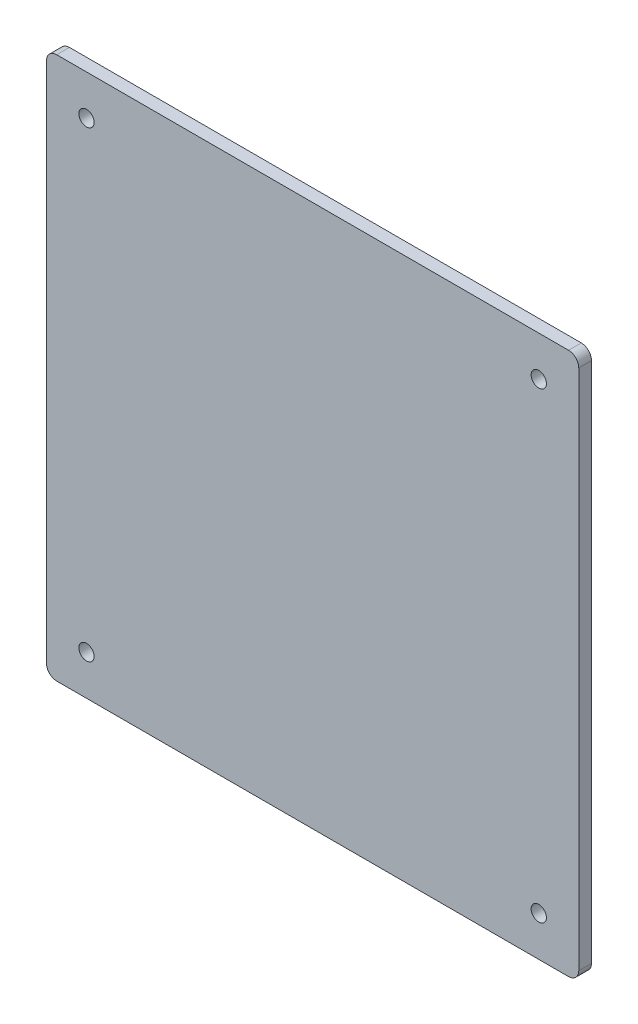
ISO-10303-21;
HEADER;
FILE_DESCRIPTION(('STEP AP214'),'2;1');
FILE_NAME('part.step','',(''),(''),'','','');
FILE_SCHEMA(('AUTOMOTIVE_DESIGN { 1 0 10303 214 1 1 1 1 }'));
ENDSEC;
DATA;
#1=APPLICATION_CONTEXT('core data for automotive mechanical design processes');
#2=APPLICATION_PROTOCOL_DEFINITION('international standard','automotive_design',2000,#1);
#3=PRODUCT_CONTEXT('',#1,'mechanical');
#4=PRODUCT('Part','Part','',(#3));
#5=PRODUCT_RELATED_PRODUCT_CATEGORY('part','',(#4));
#6=PRODUCT_DEFINITION_FORMATION('','',#4);
#7=PRODUCT_DEFINITION_CONTEXT('part definition',#1,'design');
#8=PRODUCT_DEFINITION('design','',#6,#7);
#9=PRODUCT_DEFINITION_SHAPE('','',#8);
#10=(LENGTH_UNIT() NAMED_UNIT(*) SI_UNIT(.MILLI.,.METRE.));
#11=(NAMED_UNIT(*) PLANE_ANGLE_UNIT() SI_UNIT($,.RADIAN.));
#12=(NAMED_UNIT(*) SI_UNIT($,.STERADIAN.) SOLID_ANGLE_UNIT());
#13=UNCERTAINTY_MEASURE_WITH_UNIT(LENGTH_MEASURE(1.E-05),#10,'distance_accuracy_value','');
#14=(GEOMETRIC_REPRESENTATION_CONTEXT(3) GLOBAL_UNCERTAINTY_ASSIGNED_CONTEXT((#13)) GLOBAL_UNIT_ASSIGNED_CONTEXT((#10,
#11,#12)) REPRESENTATION_CONTEXT('',''));
#15=CARTESIAN_POINT('',(0.,0.,0.));
#16=DIRECTION('',(0.,0.,1.));
#17=DIRECTION('',(1.,0.,0.));
#18=AXIS2_PLACEMENT_3D('',#15,#16,#17);
#19=CARTESIAN_POINT('',(0.,0.,3.175));
#20=DIRECTION('',(1.,0.,0.));
#21=DIRECTION('',(0.,0.,-1.));
#22=AXIS2_PLACEMENT_3D('',#19,#20,#21);
#23=PLANE('',#22);
#24=DIRECTION('',(0.,-1.,0.));
#25=VECTOR('',#24,1.);
#26=CARTESIAN_POINT('',(0.,0.,3.175));
#27=LINE('',#26,#25);
#28=CARTESIAN_POINT('',(0.,132.715,3.175));
#29=VERTEX_POINT('',#28);
#30=CARTESIAN_POINT('',(0.,2.54,3.175));
#31=VERTEX_POINT('',#30);
#32=EDGE_CURVE('E122',#29,#31,#27,.T.);
#33=ORIENTED_EDGE('',*,*,#32,.F.);
#34=DIRECTION('',(0.,0.,-1.));
#35=VECTOR('',#34,1.);
#36=CARTESIAN_POINT('',(0.,132.715,3.175));
#37=LINE('',#36,#35);
#38=CARTESIAN_POINT('',(0.,132.715,0.));
#39=VERTEX_POINT('',#38);
#40=EDGE_CURVE('E107',#29,#39,#37,.T.);
#41=ORIENTED_EDGE('',*,*,#40,.T.);
#42=DIRECTION('',(0.,-1.,0.));
#43=VECTOR('',#42,1.);
#44=CARTESIAN_POINT('',(0.,0.,0.));
#45=LINE('',#44,#43);
#46=CARTESIAN_POINT('',(0.,2.54,0.));
#47=VERTEX_POINT('',#46);
#48=EDGE_CURVE('E119',#39,#47,#45,.T.);
#49=ORIENTED_EDGE('',*,*,#48,.T.);
#50=DIRECTION('',(0.,0.,-1.));
#51=VECTOR('',#50,1.);
#52=CARTESIAN_POINT('',(0.,2.54,3.175));
#53=LINE('',#52,#51);
#54=EDGE_CURVE('E124',#47,#31,#53,.F.);
#55=ORIENTED_EDGE('',*,*,#54,.T.);
#56=EDGE_LOOP('',(#33,#41,#49,#55));
#57=FACE_BOUND('',#56,.T.);
#58=ADVANCED_FACE('F37',(#57),#23,.F.);
#59=CARTESIAN_POINT('',(0.,0.,3.175));
#60=DIRECTION('',(0.,1.,0.));
#61=DIRECTION('',(0.,0.,1.));
#62=AXIS2_PLACEMENT_3D('',#59,#60,#61);
#63=PLANE('',#62);
#64=DIRECTION('',(1.,0.,0.));
#65=VECTOR('',#64,1.);
#66=CARTESIAN_POINT('',(0.,0.,3.175));
#67=LINE('',#66,#65);
#68=CARTESIAN_POINT('',(2.54,0.,3.175));
#69=VERTEX_POINT('',#68);
#70=CARTESIAN_POINT('',(130.175,0.,3.175));
#71=VERTEX_POINT('',#70);
#72=EDGE_CURVE('E168',#69,#71,#67,.T.);
#73=ORIENTED_EDGE('',*,*,#72,.F.);
#74=DIRECTION('',(0.,0.,-1.));
#75=VECTOR('',#74,1.);
#76=CARTESIAN_POINT('',(2.54,0.,3.175));
#77=LINE('',#76,#75);
#78=CARTESIAN_POINT('',(2.54,0.,0.));
#79=VERTEX_POINT('',#78);
#80=EDGE_CURVE('E161',#69,#79,#77,.T.);
#81=ORIENTED_EDGE('',*,*,#80,.T.);
#82=DIRECTION('',(1.,0.,0.));
#83=VECTOR('',#82,1.);
#84=CARTESIAN_POINT('',(0.,0.,0.));
#85=LINE('',#84,#83);
#86=CARTESIAN_POINT('',(130.175,0.,0.));
#87=VERTEX_POINT('',#86);
#88=EDGE_CURVE('E128',#79,#87,#85,.T.);
#89=ORIENTED_EDGE('',*,*,#88,.T.);
#90=DIRECTION('',(0.,0.,-1.));
#91=VECTOR('',#90,1.);
#92=CARTESIAN_POINT('',(130.175,0.,3.175));
#93=LINE('',#92,#91);
#94=EDGE_CURVE('E159',#87,#71,#93,.F.);
#95=ORIENTED_EDGE('',*,*,#94,.T.);
#96=EDGE_LOOP('',(#73,#81,#89,#95));
#97=FACE_BOUND('',#96,.T.);
#98=ADVANCED_FACE('F166',(#97),#63,.F.);
#99=CARTESIAN_POINT('',(132.715,0.,3.175));
#100=DIRECTION('',(-1.,0.,0.));
#101=DIRECTION('',(0.,0.,1.));
#102=AXIS2_PLACEMENT_3D('',#99,#100,#101);
#103=PLANE('',#102);
#104=DIRECTION('',(0.,1.,0.));
#105=VECTOR('',#104,1.);
#106=CARTESIAN_POINT('',(132.715,0.,3.175));
#107=LINE('',#106,#105);
#108=CARTESIAN_POINT('',(132.715,2.54,3.175));
#109=VERTEX_POINT('',#108);
#110=CARTESIAN_POINT('',(132.715,132.715,3.175));
#111=VERTEX_POINT('',#110);
#112=EDGE_CURVE('E176',#109,#111,#107,.T.);
#113=ORIENTED_EDGE('',*,*,#112,.F.);
#114=DIRECTION('',(0.,0.,-1.));
#115=VECTOR('',#114,1.);
#116=CARTESIAN_POINT('',(132.715,2.54,3.175));
#117=LINE('',#116,#115);
#118=CARTESIAN_POINT('',(132.715,2.54,0.));
#119=VERTEX_POINT('',#118);
#120=EDGE_CURVE('E11',#109,#119,#117,.T.);
#121=ORIENTED_EDGE('',*,*,#120,.T.);
#122=DIRECTION('',(0.,1.,0.));
#123=VECTOR('',#122,1.);
#124=CARTESIAN_POINT('',(132.715,0.,0.));
#125=LINE('',#124,#123);
#126=CARTESIAN_POINT('',(132.715,132.715,0.));
#127=VERTEX_POINT('',#126);
#128=EDGE_CURVE('E132',#119,#127,#125,.T.);
#129=ORIENTED_EDGE('',*,*,#128,.T.);
#130=DIRECTION('',(0.,0.,-1.));
#131=VECTOR('',#130,1.);
#132=CARTESIAN_POINT('',(132.715,132.715,3.175));
#133=LINE('',#132,#131);
#134=EDGE_CURVE('E45',#127,#111,#133,.F.);
#135=ORIENTED_EDGE('',*,*,#134,.T.);
#136=EDGE_LOOP('',(#113,#121,#129,#135));
#137=FACE_BOUND('',#136,.T.);
#138=ADVANCED_FACE('F175',(#137),#103,.F.);
#139=CARTESIAN_POINT('',(0.,135.255,3.175));
#140=DIRECTION('',(0.,-1.,0.));
#141=DIRECTION('',(0.,0.,-1.));
#142=AXIS2_PLACEMENT_3D('',#139,#140,#141);
#143=PLANE('',#142);
#144=DIRECTION('',(-1.,0.,0.));
#145=VECTOR('',#144,1.);
#146=CARTESIAN_POINT('',(0.,135.255,0.));
#147=LINE('',#146,#145);
#148=CARTESIAN_POINT('',(130.175,135.255,0.));
#149=VERTEX_POINT('',#148);
#150=CARTESIAN_POINT('',(2.54,135.255,0.));
#151=VERTEX_POINT('',#150);
#152=EDGE_CURVE('E142',#149,#151,#147,.T.);
#153=ORIENTED_EDGE('',*,*,#152,.T.);
#154=DIRECTION('',(0.,0.,-1.));
#155=VECTOR('',#154,1.);
#156=CARTESIAN_POINT('',(2.54,135.255,3.175));
#157=LINE('',#156,#155);
#158=CARTESIAN_POINT('',(2.54,135.255,3.175));
#159=VERTEX_POINT('',#158);
#160=EDGE_CURVE('E108',#151,#159,#157,.F.);
#161=ORIENTED_EDGE('',*,*,#160,.T.);
#162=DIRECTION('',(-1.,0.,0.));
#163=VECTOR('',#162,1.);
#164=CARTESIAN_POINT('',(0.,135.255,3.175));
#165=LINE('',#164,#163);
#166=CARTESIAN_POINT('',(130.175,135.255,3.175));
#167=VERTEX_POINT('',#166);
#168=EDGE_CURVE('E138',#167,#159,#165,.T.);
#169=ORIENTED_EDGE('',*,*,#168,.F.);
#170=DIRECTION('',(0.,0.,-1.));
#171=VECTOR('',#170,1.);
#172=CARTESIAN_POINT('',(130.175,135.255,3.175));
#173=LINE('',#172,#171);
#174=EDGE_CURVE('E113',#167,#149,#173,.T.);
#175=ORIENTED_EDGE('',*,*,#174,.T.);
#176=EDGE_LOOP('',(#153,#161,#169,#175));
#177=FACE_BOUND('',#176,.T.);
#178=ADVANCED_FACE('F216',(#177),#143,.F.);
#179=CARTESIAN_POINT('',(0.,0.,3.175));
#180=DIRECTION('',(0.,0.,-1.));
#181=DIRECTION('',(-1.,0.,0.));
#182=AXIS2_PLACEMENT_3D('',#179,#180,#181);
#183=PLANE('',#182);
#184=CARTESIAN_POINT('',(9.96950000000001,9.96950000000001,3.175));
#185=DIRECTION('',(0.,0.,1.));
#186=DIRECTION('',(1.,0.,0.));
#187=AXIS2_PLACEMENT_3D('',#184,#185,#186);
#188=CIRCLE('',#187,1.905);
#189=CARTESIAN_POINT('',(11.8745,9.96950000000001,3.175));
#190=VERTEX_POINT('',#189);
#191=EDGE_CURVE('E185',#190,#190,#188,.T.);
#192=ORIENTED_EDGE('',*,*,#191,.F.);
#193=EDGE_LOOP('',(#192));
#194=FACE_BOUND('',#193,.T.);
#195=CARTESIAN_POINT('',(122.7455,9.96950000000001,3.175));
#196=DIRECTION('',(0.,0.,1.));
#197=DIRECTION('',(1.,0.,0.));
#198=AXIS2_PLACEMENT_3D('',#195,#196,#197);
#199=CIRCLE('',#198,1.90500000000005);
#200=CARTESIAN_POINT('',(124.6505,9.96950000000001,3.175));
#201=VERTEX_POINT('',#200);
#202=EDGE_CURVE('E191',#201,#201,#199,.T.);
#203=ORIENTED_EDGE('',*,*,#202,.F.);
#204=EDGE_LOOP('',(#203));
#205=FACE_BOUND('',#204,.T.);
#206=CARTESIAN_POINT('',(122.7455,125.2855,3.175));
#207=DIRECTION('',(0.,0.,1.));
#208=DIRECTION('',(1.,0.,0.));
#209=AXIS2_PLACEMENT_3D('',#206,#207,#208);
#210=CIRCLE('',#209,1.90500000000008);
#211=CARTESIAN_POINT('',(124.6505,125.2855,3.175));
#212=VERTEX_POINT('',#211);
#213=EDGE_CURVE('E197',#212,#212,#210,.T.);
#214=ORIENTED_EDGE('',*,*,#213,.F.);
#215=EDGE_LOOP('',(#214));
#216=FACE_BOUND('',#215,.T.);
#217=CARTESIAN_POINT('',(9.96950000000001,125.2855,3.175));
#218=DIRECTION('',(0.,0.,1.));
#219=DIRECTION('',(1.,0.,0.));
#220=AXIS2_PLACEMENT_3D('',#217,#218,#219);
#221=CIRCLE('',#220,1.905);
#222=CARTESIAN_POINT('',(11.8745,125.2855,3.175));
#223=VERTEX_POINT('',#222);
#224=EDGE_CURVE('E135',#223,#223,#221,.T.);
#225=ORIENTED_EDGE('',*,*,#224,.F.);
#226=EDGE_LOOP('',(#225));
#227=FACE_BOUND('',#226,.T.);
#228=ORIENTED_EDGE('',*,*,#168,.T.);
#229=CARTESIAN_POINT('',(2.54,132.715,3.175));
#230=DIRECTION('',(0.,0.,-1.));
#231=DIRECTION('',(-1.,0.,0.));
#232=AXIS2_PLACEMENT_3D('',#229,#230,#231);
#233=CIRCLE('',#232,2.54);
#234=EDGE_CURVE('E157',#159,#29,#233,.F.);
#235=ORIENTED_EDGE('',*,*,#234,.T.);
#236=ORIENTED_EDGE('',*,*,#32,.T.);
#237=CARTESIAN_POINT('',(2.54,2.54,3.175));
#238=DIRECTION('',(0.,0.,-1.));
#239=DIRECTION('',(-1.,0.,0.));
#240=AXIS2_PLACEMENT_3D('',#237,#238,#239);
#241=CIRCLE('',#240,2.54);
#242=EDGE_CURVE('E155',#31,#69,#241,.F.);
#243=ORIENTED_EDGE('',*,*,#242,.T.);
#244=ORIENTED_EDGE('',*,*,#72,.T.);
#245=CARTESIAN_POINT('',(130.175,2.54,3.175));
#246=DIRECTION('',(0.,0.,-1.));
#247=DIRECTION('',(-1.,0.,0.));
#248=AXIS2_PLACEMENT_3D('',#245,#246,#247);
#249=CIRCLE('',#248,2.54);
#250=EDGE_CURVE('E58',#71,#109,#249,.F.);
#251=ORIENTED_EDGE('',*,*,#250,.T.);
#252=ORIENTED_EDGE('',*,*,#112,.T.);
#253=CARTESIAN_POINT('',(130.175,132.715,3.175));
#254=DIRECTION('',(0.,0.,-1.));
#255=DIRECTION('',(-1.,0.,0.));
#256=AXIS2_PLACEMENT_3D('',#253,#254,#255);
#257=CIRCLE('',#256,2.54);
#258=EDGE_CURVE('E152',#111,#167,#257,.F.);
#259=ORIENTED_EDGE('',*,*,#258,.T.);
#260=EDGE_LOOP('',(#228,#235,#236,#243,#244,#251,#252,#259));
#261=FACE_BOUND('',#260,.T.);
#262=ADVANCED_FACE('F213',(#194,#205,#216,#227,#261),#183,.F.);
#263=CARTESIAN_POINT('',(0.,0.,0.));
#264=DIRECTION('',(0.,0.,-1.));
#265=DIRECTION('',(-1.,0.,0.));
#266=AXIS2_PLACEMENT_3D('',#263,#264,#265);
#267=PLANE('',#266);
#268=CARTESIAN_POINT('',(9.96950000000001,9.96950000000001,0.));
#269=DIRECTION('',(0.,0.,1.));
#270=DIRECTION('',(1.,0.,0.));
#271=AXIS2_PLACEMENT_3D('',#268,#269,#270);
#272=CIRCLE('',#271,1.905);
#273=CARTESIAN_POINT('',(11.8745,9.96950000000001,0.));
#274=VERTEX_POINT('',#273);
#275=EDGE_CURVE('E188',#274,#274,#272,.T.);
#276=ORIENTED_EDGE('',*,*,#275,.T.);
#277=EDGE_LOOP('',(#276));
#278=FACE_BOUND('',#277,.T.);
#279=CARTESIAN_POINT('',(122.7455,9.96950000000001,0.));
#280=DIRECTION('',(0.,0.,1.));
#281=DIRECTION('',(1.,0.,0.));
#282=AXIS2_PLACEMENT_3D('',#279,#280,#281);
#283=CIRCLE('',#282,1.90500000000005);
#284=CARTESIAN_POINT('',(124.6505,9.96950000000001,0.));
#285=VERTEX_POINT('',#284);
#286=EDGE_CURVE('E194',#285,#285,#283,.T.);
#287=ORIENTED_EDGE('',*,*,#286,.T.);
#288=EDGE_LOOP('',(#287));
#289=FACE_BOUND('',#288,.T.);
#290=CARTESIAN_POINT('',(122.7455,125.2855,0.));
#291=DIRECTION('',(0.,0.,1.));
#292=DIRECTION('',(1.,0.,0.));
#293=AXIS2_PLACEMENT_3D('',#290,#291,#292);
#294=CIRCLE('',#293,1.90500000000008);
#295=CARTESIAN_POINT('',(124.6505,125.2855,0.));
#296=VERTEX_POINT('',#295);
#297=EDGE_CURVE('E183',#296,#296,#294,.T.);
#298=ORIENTED_EDGE('',*,*,#297,.T.);
#299=EDGE_LOOP('',(#298));
#300=FACE_BOUND('',#299,.T.);
#301=CARTESIAN_POINT('',(9.96950000000001,125.2855,0.));
#302=DIRECTION('',(0.,0.,1.));
#303=DIRECTION('',(1.,0.,0.));
#304=AXIS2_PLACEMENT_3D('',#301,#302,#303);
#305=CIRCLE('',#304,1.905);
#306=CARTESIAN_POINT('',(11.8745,125.2855,0.));
#307=VERTEX_POINT('',#306);
#308=EDGE_CURVE('E129',#307,#307,#305,.T.);
#309=ORIENTED_EDGE('',*,*,#308,.T.);
#310=EDGE_LOOP('',(#309));
#311=FACE_BOUND('',#310,.T.);
#312=ORIENTED_EDGE('',*,*,#48,.F.);
#313=CARTESIAN_POINT('',(2.54,132.715,0.));
#314=DIRECTION('',(0.,0.,-1.));
#315=DIRECTION('',(-1.,0.,0.));
#316=AXIS2_PLACEMENT_3D('',#313,#314,#315);
#317=CIRCLE('',#316,2.54);
#318=EDGE_CURVE('E103',#39,#151,#317,.T.);
#319=ORIENTED_EDGE('',*,*,#318,.T.);
#320=ORIENTED_EDGE('',*,*,#152,.F.);
#321=CARTESIAN_POINT('',(130.175,132.715,0.));
#322=DIRECTION('',(0.,0.,-1.));
#323=DIRECTION('',(-1.,0.,0.));
#324=AXIS2_PLACEMENT_3D('',#321,#322,#323);
#325=CIRCLE('',#324,2.54);
#326=EDGE_CURVE('E123',#149,#127,#325,.T.);
#327=ORIENTED_EDGE('',*,*,#326,.T.);
#328=ORIENTED_EDGE('',*,*,#128,.F.);
#329=CARTESIAN_POINT('',(130.175,2.54,0.));
#330=DIRECTION('',(0.,0.,-1.));
#331=DIRECTION('',(-1.,0.,0.));
#332=AXIS2_PLACEMENT_3D('',#329,#330,#331);
#333=CIRCLE('',#332,2.54);
#334=EDGE_CURVE('E146',#119,#87,#333,.T.);
#335=ORIENTED_EDGE('',*,*,#334,.T.);
#336=ORIENTED_EDGE('',*,*,#88,.F.);
#337=CARTESIAN_POINT('',(2.54,2.54,0.));
#338=DIRECTION('',(0.,0.,-1.));
#339=DIRECTION('',(-1.,0.,0.));
#340=AXIS2_PLACEMENT_3D('',#337,#338,#339);
#341=CIRCLE('',#340,2.54);
#342=EDGE_CURVE('E114',#79,#47,#341,.T.);
#343=ORIENTED_EDGE('',*,*,#342,.T.);
#344=EDGE_LOOP('',(#312,#319,#320,#327,#328,#335,#336,#343));
#345=FACE_BOUND('',#344,.T.);
#346=ADVANCED_FACE('F126',(#278,#289,#300,#311,#345),#267,.T.);
#347=CARTESIAN_POINT('',(9.96950000000001,125.2855,0.));
#348=DIRECTION('',(0.,0.,1.));
#349=DIRECTION('',(1.,0.,0.));
#350=AXIS2_PLACEMENT_3D('',#347,#348,#349);
#351=CYLINDRICAL_SURFACE('',#350,1.905);
#352=ORIENTED_EDGE('',*,*,#308,.F.);
#353=EDGE_LOOP('',(#352));
#354=FACE_BOUND('',#353,.T.);
#355=ORIENTED_EDGE('',*,*,#224,.T.);
#356=EDGE_LOOP('',(#355));
#357=FACE_BOUND('',#356,.T.);
#358=ADVANCED_FACE('F209',(#354,#357),#351,.F.);
#359=CARTESIAN_POINT('',(122.7455,125.2855,0.));
#360=DIRECTION('',(0.,0.,1.));
#361=DIRECTION('',(1.,0.,0.));
#362=AXIS2_PLACEMENT_3D('',#359,#360,#361);
#363=CYLINDRICAL_SURFACE('',#362,1.90500000000008);
#364=ORIENTED_EDGE('',*,*,#297,.F.);
#365=EDGE_LOOP('',(#364));
#366=FACE_BOUND('',#365,.T.);
#367=ORIENTED_EDGE('',*,*,#213,.T.);
#368=EDGE_LOOP('',(#367));
#369=FACE_BOUND('',#368,.T.);
#370=ADVANCED_FACE('F205',(#366,#369),#363,.F.);
#371=CARTESIAN_POINT('',(122.7455,9.96950000000001,0.));
#372=DIRECTION('',(0.,0.,1.));
#373=DIRECTION('',(1.,0.,0.));
#374=AXIS2_PLACEMENT_3D('',#371,#372,#373);
#375=CYLINDRICAL_SURFACE('',#374,1.90500000000005);
#376=ORIENTED_EDGE('',*,*,#286,.F.);
#377=EDGE_LOOP('',(#376));
#378=FACE_BOUND('',#377,.T.);
#379=ORIENTED_EDGE('',*,*,#202,.T.);
#380=EDGE_LOOP('',(#379));
#381=FACE_BOUND('',#380,.T.);
#382=ADVANCED_FACE('F208',(#378,#381),#375,.F.);
#383=CARTESIAN_POINT('',(9.96950000000001,9.96950000000001,0.));
#384=DIRECTION('',(0.,0.,1.));
#385=DIRECTION('',(1.,0.,0.));
#386=AXIS2_PLACEMENT_3D('',#383,#384,#385);
#387=CYLINDRICAL_SURFACE('',#386,1.905);
#388=ORIENTED_EDGE('',*,*,#275,.F.);
#389=EDGE_LOOP('',(#388));
#390=FACE_BOUND('',#389,.T.);
#391=ORIENTED_EDGE('',*,*,#191,.T.);
#392=EDGE_LOOP('',(#391));
#393=FACE_BOUND('',#392,.T.);
#394=ADVANCED_FACE('F239',(#390,#393),#387,.F.);
#395=CARTESIAN_POINT('',(2.54,132.715,3.175));
#396=DIRECTION('',(0.,0.,-1.));
#397=DIRECTION('',(-1.,0.,0.));
#398=AXIS2_PLACEMENT_3D('',#395,#396,#397);
#399=CYLINDRICAL_SURFACE('',#398,2.54);
#400=ORIENTED_EDGE('',*,*,#234,.F.);
#401=ORIENTED_EDGE('',*,*,#160,.F.);
#402=ORIENTED_EDGE('',*,*,#318,.F.);
#403=ORIENTED_EDGE('',*,*,#40,.F.);
#404=EDGE_LOOP('',(#400,#401,#402,#403));
#405=FACE_BOUND('',#404,.T.);
#406=ADVANCED_FACE('F106',(#405),#399,.T.);
#407=CARTESIAN_POINT('',(2.54,2.54,3.175));
#408=DIRECTION('',(0.,0.,-1.));
#409=DIRECTION('',(-1.,0.,0.));
#410=AXIS2_PLACEMENT_3D('',#407,#408,#409);
#411=CYLINDRICAL_SURFACE('',#410,2.54);
#412=ORIENTED_EDGE('',*,*,#242,.F.);
#413=ORIENTED_EDGE('',*,*,#54,.F.);
#414=ORIENTED_EDGE('',*,*,#342,.F.);
#415=ORIENTED_EDGE('',*,*,#80,.F.);
#416=EDGE_LOOP('',(#412,#413,#414,#415));
#417=FACE_BOUND('',#416,.T.);
#418=ADVANCED_FACE('F228',(#417),#411,.T.);
#419=CARTESIAN_POINT('',(130.175,2.54,3.175));
#420=DIRECTION('',(0.,0.,-1.));
#421=DIRECTION('',(-1.,0.,0.));
#422=AXIS2_PLACEMENT_3D('',#419,#420,#421);
#423=CYLINDRICAL_SURFACE('',#422,2.54);
#424=ORIENTED_EDGE('',*,*,#250,.F.);
#425=ORIENTED_EDGE('',*,*,#94,.F.);
#426=ORIENTED_EDGE('',*,*,#334,.F.);
#427=ORIENTED_EDGE('',*,*,#120,.F.);
#428=EDGE_LOOP('',(#424,#425,#426,#427));
#429=FACE_BOUND('',#428,.T.);
#430=ADVANCED_FACE('F174',(#429),#423,.T.);
#431=CARTESIAN_POINT('',(130.175,132.715,3.175));
#432=DIRECTION('',(0.,0.,-1.));
#433=DIRECTION('',(-1.,0.,0.));
#434=AXIS2_PLACEMENT_3D('',#431,#432,#433);
#435=CYLINDRICAL_SURFACE('',#434,2.54);
#436=ORIENTED_EDGE('',*,*,#258,.F.);
#437=ORIENTED_EDGE('',*,*,#134,.F.);
#438=ORIENTED_EDGE('',*,*,#326,.F.);
#439=ORIENTED_EDGE('',*,*,#174,.F.);
#440=EDGE_LOOP('',(#436,#437,#438,#439));
#441=FACE_BOUND('',#440,.T.);
#442=ADVANCED_FACE('F39',(#441),#435,.T.);
#443=CLOSED_SHELL('',(#58,#98,#138,#178,#262,#346,#358,#370,#382,#394,#406,#418,#430,#442));
#444=MANIFOLD_SOLID_BREP('B2',#443);
#445=ADVANCED_BREP_SHAPE_REPRESENTATION('',(#18,#444),#14);
#446=SHAPE_DEFINITION_REPRESENTATION(#9,#445);
ENDSEC;
END-ISO-10303-21;
